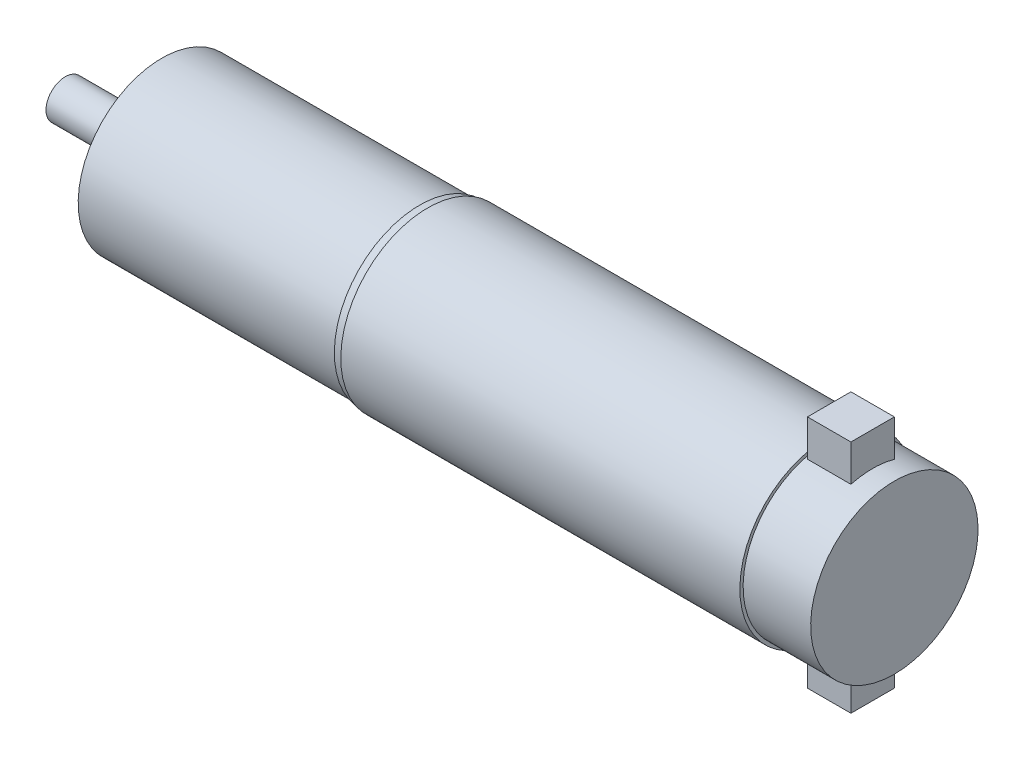
ISO-10303-21;
HEADER;
FILE_DESCRIPTION(('STEP AP214'),'2;1');
FILE_NAME('part.step','',(''),(''),'','','');
FILE_SCHEMA(('AUTOMOTIVE_DESIGN { 1 0 10303 214 1 1 1 1 }'));
ENDSEC;
DATA;
#1=APPLICATION_CONTEXT('core data for automotive mechanical design processes');
#2=APPLICATION_PROTOCOL_DEFINITION('international standard','automotive_design',2000,#1);
#3=PRODUCT_CONTEXT('',#1,'mechanical');
#4=PRODUCT('Part','Part','',(#3));
#5=PRODUCT_RELATED_PRODUCT_CATEGORY('part','',(#4));
#6=PRODUCT_DEFINITION_FORMATION('','',#4);
#7=PRODUCT_DEFINITION_CONTEXT('part definition',#1,'design');
#8=PRODUCT_DEFINITION('design','',#6,#7);
#9=PRODUCT_DEFINITION_SHAPE('','',#8);
#10=(LENGTH_UNIT() NAMED_UNIT(*) SI_UNIT(.MILLI.,.METRE.));
#11=(NAMED_UNIT(*) PLANE_ANGLE_UNIT() SI_UNIT($,.RADIAN.));
#12=(NAMED_UNIT(*) SI_UNIT($,.STERADIAN.) SOLID_ANGLE_UNIT());
#13=UNCERTAINTY_MEASURE_WITH_UNIT(LENGTH_MEASURE(1.E-05),#10,'distance_accuracy_value','');
#14=(GEOMETRIC_REPRESENTATION_CONTEXT(3) GLOBAL_UNCERTAINTY_ASSIGNED_CONTEXT((#13)) GLOBAL_UNIT_ASSIGNED_CONTEXT((#10,
#11,#12)) REPRESENTATION_CONTEXT('',''));
#15=CARTESIAN_POINT('',(0.,0.,0.));
#16=DIRECTION('',(0.,0.,1.));
#17=DIRECTION('',(1.,0.,0.));
#18=AXIS2_PLACEMENT_3D('',#15,#16,#17);
#19=CARTESIAN_POINT('',(-30.,26.,0.));
#20=DIRECTION('',(-1.,0.,0.));
#21=DIRECTION('',(0.,-1.,0.));
#22=AXIS2_PLACEMENT_3D('',#19,#20,#21);
#23=CYLINDRICAL_SURFACE('',#22,26.);
#24=CARTESIAN_POINT('',(227.6,26.,0.));
#25=DIRECTION('',(-1.,0.,0.));
#26=DIRECTION('',(0.,-1.,0.));
#27=AXIS2_PLACEMENT_3D('',#24,#25,#26);
#28=CIRCLE('',#27,26.);
#29=CARTESIAN_POINT('',(227.6,0.,0.));
#30=VERTEX_POINT('',#29);
#31=EDGE_CURVE('E127',#30,#30,#28,.T.);
#32=ORIENTED_EDGE('',*,*,#31,.T.);
#33=EDGE_LOOP('',(#32));
#34=FACE_BOUND('',#33,.T.);
#35=CARTESIAN_POINT('',(206.6,26.,0.));
#36=DIRECTION('',(-1.,0.,0.));
#37=DIRECTION('',(0.,-1.,0.));
#38=AXIS2_PLACEMENT_3D('',#35,#36,#37);
#39=CIRCLE('',#38,26.);
#40=CARTESIAN_POINT('',(206.6,0.,0.));
#41=VERTEX_POINT('',#40);
#42=EDGE_CURVE('E165',#41,#41,#39,.T.);
#43=ORIENTED_EDGE('',*,*,#42,.F.);
#44=EDGE_LOOP('',(#43));
#45=FACE_BOUND('',#44,.T.);
#46=DIRECTION('',(-1.,0.,0.));
#47=VECTOR('',#46,1.);
#48=CARTESIAN_POINT('',(-30.,0.891485507899921,-6.75));
#49=LINE('',#48,#47);
#50=CARTESIAN_POINT('',(220.85,0.891485507899928,-6.75));
#51=VERTEX_POINT('',#50);
#52=CARTESIAN_POINT('',(207.35,0.891485507899927,-6.75));
#53=VERTEX_POINT('',#52);
#54=EDGE_CURVE('E168',#51,#53,#49,.T.);
#55=ORIENTED_EDGE('',*,*,#54,.T.);
#56=CARTESIAN_POINT('',(207.35,26.,0.));
#57=DIRECTION('',(1.,0.,0.));
#58=DIRECTION('',(0.,0.,-1.));
#59=AXIS2_PLACEMENT_3D('',#56,#57,#58);
#60=CIRCLE('',#59,26.);
#61=CARTESIAN_POINT('',(207.35,0.891485507899928,6.75));
#62=VERTEX_POINT('',#61);
#63=EDGE_CURVE('E47',#53,#62,#60,.F.);
#64=ORIENTED_EDGE('',*,*,#63,.T.);
#65=DIRECTION('',(-1.,0.,0.));
#66=VECTOR('',#65,1.);
#67=CARTESIAN_POINT('',(-30.,0.891485507899921,6.75));
#68=LINE('',#67,#66);
#69=CARTESIAN_POINT('',(220.85,0.891485507899928,6.75));
#70=VERTEX_POINT('',#69);
#71=EDGE_CURVE('E174',#62,#70,#68,.F.);
#72=ORIENTED_EDGE('',*,*,#71,.T.);
#73=CARTESIAN_POINT('',(220.85,26.,0.));
#74=DIRECTION('',(-1.,0.,0.));
#75=DIRECTION('',(0.,0.,1.));
#76=AXIS2_PLACEMENT_3D('',#73,#74,#75);
#77=CIRCLE('',#76,26.);
#78=EDGE_CURVE('E171',#70,#51,#77,.F.);
#79=ORIENTED_EDGE('',*,*,#78,.T.);
#80=EDGE_LOOP('',(#55,#64,#72,#79));
#81=FACE_BOUND('',#80,.T.);
#82=DIRECTION('',(-1.,0.,0.));
#83=VECTOR('',#82,1.);
#84=CARTESIAN_POINT('',(-30.,51.1085144921001,6.75));
#85=LINE('',#84,#83);
#86=CARTESIAN_POINT('',(220.85,51.1085144921001,6.75));
#87=VERTEX_POINT('',#86);
#88=CARTESIAN_POINT('',(207.35,51.1085144921001,6.75));
#89=VERTEX_POINT('',#88);
#90=EDGE_CURVE('E41',#87,#89,#85,.T.);
#91=ORIENTED_EDGE('',*,*,#90,.T.);
#92=CARTESIAN_POINT('',(207.35,51.1085144921001,-6.75));
#93=VERTEX_POINT('',#92);
#94=EDGE_CURVE('E11',#89,#93,#60,.F.);
#95=ORIENTED_EDGE('',*,*,#94,.T.);
#96=DIRECTION('',(-1.,0.,0.));
#97=VECTOR('',#96,1.);
#98=CARTESIAN_POINT('',(-30.,51.1085144921001,-6.75));
#99=LINE('',#98,#97);
#100=CARTESIAN_POINT('',(220.85,51.1085144921001,-6.75));
#101=VERTEX_POINT('',#100);
#102=EDGE_CURVE('E178',#93,#101,#99,.F.);
#103=ORIENTED_EDGE('',*,*,#102,.T.);
#104=EDGE_CURVE('E175',#101,#87,#77,.F.);
#105=ORIENTED_EDGE('',*,*,#104,.T.);
#106=EDGE_LOOP('',(#91,#95,#103,#105));
#107=FACE_BOUND('',#106,.T.);
#108=ADVANCED_FACE('F38',(#34,#45,#81,#107),#23,.T.);
#109=CARTESIAN_POINT('',(206.6,0.,0.));
#110=DIRECTION('',(-1.,0.,0.));
#111=DIRECTION('',(0.,-1.,0.));
#112=AXIS2_PLACEMENT_3D('',#109,#110,#111);
#113=PLANE('',#112);
#114=CARTESIAN_POINT('',(206.6,26.,0.));
#115=DIRECTION('',(-1.,0.,0.));
#116=DIRECTION('',(0.,-1.,0.));
#117=AXIS2_PLACEMENT_3D('',#114,#115,#116);
#118=CIRCLE('',#117,27.);
#119=CARTESIAN_POINT('',(206.6,-0.999999999999994,0.));
#120=VERTEX_POINT('',#119);
#121=EDGE_CURVE('E162',#120,#120,#118,.T.);
#122=ORIENTED_EDGE('',*,*,#121,.F.);
#123=EDGE_LOOP('',(#122));
#124=FACE_BOUND('',#123,.T.);
#125=ORIENTED_EDGE('',*,*,#42,.T.);
#126=EDGE_LOOP('',(#125));
#127=FACE_BOUND('',#126,.T.);
#128=ADVANCED_FACE('F220',(#124,#127),#113,.F.);
#129=CARTESIAN_POINT('',(-30.,26.,0.));
#130=DIRECTION('',(-1.,0.,0.));
#131=DIRECTION('',(0.,-1.,0.));
#132=AXIS2_PLACEMENT_3D('',#129,#130,#131);
#133=CYLINDRICAL_SURFACE('',#132,27.);
#134=ORIENTED_EDGE('',*,*,#121,.T.);
#135=EDGE_LOOP('',(#134));
#136=FACE_BOUND('',#135,.T.);
#137=CARTESIAN_POINT('',(82.6,26.,0.));
#138=DIRECTION('',(-1.,0.,0.));
#139=DIRECTION('',(0.,-1.,0.));
#140=AXIS2_PLACEMENT_3D('',#137,#138,#139);
#141=CIRCLE('',#140,27.);
#142=CARTESIAN_POINT('',(82.6,-0.999999999999994,0.));
#143=VERTEX_POINT('',#142);
#144=EDGE_CURVE('E159',#143,#143,#141,.T.);
#145=ORIENTED_EDGE('',*,*,#144,.F.);
#146=EDGE_LOOP('',(#145));
#147=FACE_BOUND('',#146,.T.);
#148=ADVANCED_FACE('F225',(#136,#147),#133,.T.);
#149=CARTESIAN_POINT('',(82.6,0.,0.));
#150=DIRECTION('',(-1.,0.,0.));
#151=DIRECTION('',(0.,-1.,0.));
#152=AXIS2_PLACEMENT_3D('',#149,#150,#151);
#153=PLANE('',#152);
#154=ORIENTED_EDGE('',*,*,#144,.T.);
#155=EDGE_LOOP('',(#154));
#156=FACE_BOUND('',#155,.T.);
#157=CARTESIAN_POINT('',(82.6,26.,0.));
#158=DIRECTION('',(-1.,0.,0.));
#159=DIRECTION('',(0.,-1.,0.));
#160=AXIS2_PLACEMENT_3D('',#157,#158,#159);
#161=CIRCLE('',#160,26.5);
#162=CARTESIAN_POINT('',(82.6,-0.499999999999994,0.));
#163=VERTEX_POINT('',#162);
#164=EDGE_CURVE('E156',#163,#163,#161,.T.);
#165=ORIENTED_EDGE('',*,*,#164,.F.);
#166=EDGE_LOOP('',(#165));
#167=FACE_BOUND('',#166,.T.);
#168=ADVANCED_FACE('F295',(#156,#167),#153,.T.);
#169=CARTESIAN_POINT('',(-30.,26.,0.));
#170=DIRECTION('',(-1.,0.,0.));
#171=DIRECTION('',(0.,-1.,0.));
#172=AXIS2_PLACEMENT_3D('',#169,#170,#171);
#173=CYLINDRICAL_SURFACE('',#172,26.5);
#174=ORIENTED_EDGE('',*,*,#164,.T.);
#175=EDGE_LOOP('',(#174));
#176=FACE_BOUND('',#175,.T.);
#177=CARTESIAN_POINT('',(80.1,26.,0.));
#178=DIRECTION('',(-1.,0.,0.));
#179=DIRECTION('',(0.,-1.,0.));
#180=AXIS2_PLACEMENT_3D('',#177,#178,#179);
#181=CIRCLE('',#180,26.5);
#182=CARTESIAN_POINT('',(80.1,-0.499999999999994,0.));
#183=VERTEX_POINT('',#182);
#184=EDGE_CURVE('E153',#183,#183,#181,.T.);
#185=ORIENTED_EDGE('',*,*,#184,.F.);
#186=EDGE_LOOP('',(#185));
#187=FACE_BOUND('',#186,.T.);
#188=ADVANCED_FACE('F291',(#176,#187),#173,.T.);
#189=CARTESIAN_POINT('',(80.1,0.,0.));
#190=DIRECTION('',(-1.,0.,0.));
#191=DIRECTION('',(0.,-1.,0.));
#192=AXIS2_PLACEMENT_3D('',#189,#190,#191);
#193=PLANE('',#192);
#194=ORIENTED_EDGE('',*,*,#184,.T.);
#195=EDGE_LOOP('',(#194));
#196=FACE_BOUND('',#195,.T.);
#197=CARTESIAN_POINT('',(80.1,26.,0.));
#198=DIRECTION('',(-1.,0.,0.));
#199=DIRECTION('',(0.,-1.,0.));
#200=AXIS2_PLACEMENT_3D('',#197,#198,#199);
#201=CIRCLE('',#200,26.);
#202=CARTESIAN_POINT('',(80.1,0.,0.));
#203=VERTEX_POINT('',#202);
#204=EDGE_CURVE('E150',#203,#203,#201,.T.);
#205=ORIENTED_EDGE('',*,*,#204,.F.);
#206=EDGE_LOOP('',(#205));
#207=FACE_BOUND('',#206,.T.);
#208=ADVANCED_FACE('F287',(#196,#207),#193,.T.);
#209=CARTESIAN_POINT('',(-30.,26.,0.));
#210=DIRECTION('',(-1.,0.,0.));
#211=DIRECTION('',(0.,-1.,0.));
#212=AXIS2_PLACEMENT_3D('',#209,#210,#211);
#213=CYLINDRICAL_SURFACE('',#212,26.);
#214=ORIENTED_EDGE('',*,*,#204,.T.);
#215=EDGE_LOOP('',(#214));
#216=FACE_BOUND('',#215,.T.);
#217=CARTESIAN_POINT('',(0.,26.,0.));
#218=DIRECTION('',(-1.,0.,0.));
#219=DIRECTION('',(0.,-1.,0.));
#220=AXIS2_PLACEMENT_3D('',#217,#218,#219);
#221=CIRCLE('',#220,26.);
#222=CARTESIAN_POINT('',(0.,0.,0.));
#223=VERTEX_POINT('',#222);
#224=EDGE_CURVE('E147',#223,#223,#221,.T.);
#225=ORIENTED_EDGE('',*,*,#224,.F.);
#226=EDGE_LOOP('',(#225));
#227=FACE_BOUND('',#226,.T.);
#228=ADVANCED_FACE('F283',(#216,#227),#213,.T.);
#229=CARTESIAN_POINT('',(0.,0.,0.));
#230=DIRECTION('',(-1.,0.,0.));
#231=DIRECTION('',(0.,-1.,0.));
#232=AXIS2_PLACEMENT_3D('',#229,#230,#231);
#233=PLANE('',#232);
#234=ORIENTED_EDGE('',*,*,#224,.T.);
#235=EDGE_LOOP('',(#234));
#236=FACE_BOUND('',#235,.T.);
#237=CARTESIAN_POINT('',(0.,26.,0.));
#238=DIRECTION('',(-1.,0.,0.));
#239=DIRECTION('',(0.,-1.,0.));
#240=AXIS2_PLACEMENT_3D('',#237,#238,#239);
#241=CIRCLE('',#240,16.);
#242=CARTESIAN_POINT('',(0.,10.,0.));
#243=VERTEX_POINT('',#242);
#244=EDGE_CURVE('E144',#243,#243,#241,.T.);
#245=ORIENTED_EDGE('',*,*,#244,.F.);
#246=EDGE_LOOP('',(#245));
#247=FACE_BOUND('',#246,.T.);
#248=ADVANCED_FACE('F279',(#236,#247),#233,.T.);
#249=CARTESIAN_POINT('',(-30.,26.,0.));
#250=DIRECTION('',(-1.,0.,0.));
#251=DIRECTION('',(0.,-1.,0.));
#252=AXIS2_PLACEMENT_3D('',#249,#250,#251);
#253=CYLINDRICAL_SURFACE('',#252,16.);
#254=CARTESIAN_POINT('',(-2.,26.,0.));
#255=DIRECTION('',(-1.,0.,0.));
#256=DIRECTION('',(0.,-1.,0.));
#257=AXIS2_PLACEMENT_3D('',#254,#255,#256);
#258=CIRCLE('',#257,16.);
#259=CARTESIAN_POINT('',(-2.,10.,0.));
#260=VERTEX_POINT('',#259);
#261=EDGE_CURVE('E141',#260,#260,#258,.T.);
#262=ORIENTED_EDGE('',*,*,#261,.F.);
#263=EDGE_LOOP('',(#262));
#264=FACE_BOUND('',#263,.T.);
#265=ORIENTED_EDGE('',*,*,#244,.T.);
#266=EDGE_LOOP('',(#265));
#267=FACE_BOUND('',#266,.T.);
#268=ADVANCED_FACE('F275',(#264,#267),#253,.T.);
#269=CARTESIAN_POINT('',(-2.,0.,0.));
#270=DIRECTION('',(1.,0.,0.));
#271=DIRECTION('',(0.,1.,0.));
#272=AXIS2_PLACEMENT_3D('',#269,#270,#271);
#273=PLANE('',#272);
#274=CARTESIAN_POINT('',(-2.,26.,0.));
#275=DIRECTION('',(-1.,0.,0.));
#276=DIRECTION('',(0.,-1.,0.));
#277=AXIS2_PLACEMENT_3D('',#274,#275,#276);
#278=CIRCLE('',#277,6.);
#279=CARTESIAN_POINT('',(-2.,20.,0.));
#280=VERTEX_POINT('',#279);
#281=EDGE_CURVE('E138',#280,#280,#278,.T.);
#282=ORIENTED_EDGE('',*,*,#281,.F.);
#283=EDGE_LOOP('',(#282));
#284=FACE_BOUND('',#283,.T.);
#285=ORIENTED_EDGE('',*,*,#261,.T.);
#286=EDGE_LOOP('',(#285));
#287=FACE_BOUND('',#286,.T.);
#288=ADVANCED_FACE('F271',(#284,#287),#273,.F.);
#289=CARTESIAN_POINT('',(-30.,26.,0.));
#290=DIRECTION('',(-1.,0.,0.));
#291=DIRECTION('',(0.,-1.,0.));
#292=AXIS2_PLACEMENT_3D('',#289,#290,#291);
#293=CYLINDRICAL_SURFACE('',#292,6.);
#294=CARTESIAN_POINT('',(-30.,26.,0.));
#295=DIRECTION('',(-1.,0.,0.));
#296=DIRECTION('',(0.,-1.,0.));
#297=AXIS2_PLACEMENT_3D('',#294,#295,#296);
#298=CIRCLE('',#297,6.);
#299=CARTESIAN_POINT('',(-30.,20.,0.));
#300=VERTEX_POINT('',#299);
#301=EDGE_CURVE('E131',#300,#300,#298,.T.);
#302=ORIENTED_EDGE('',*,*,#301,.F.);
#303=EDGE_LOOP('',(#302));
#304=FACE_BOUND('',#303,.T.);
#305=ORIENTED_EDGE('',*,*,#281,.T.);
#306=EDGE_LOOP('',(#305));
#307=FACE_BOUND('',#306,.T.);
#308=ADVANCED_FACE('F265',(#304,#307),#293,.T.);
#309=CARTESIAN_POINT('',(-30.,0.,0.));
#310=DIRECTION('',(1.,0.,0.));
#311=DIRECTION('',(0.,1.,0.));
#312=AXIS2_PLACEMENT_3D('',#309,#310,#311);
#313=PLANE('',#312);
#314=ORIENTED_EDGE('',*,*,#301,.T.);
#315=EDGE_LOOP('',(#314));
#316=FACE_BOUND('',#315,.T.);
#317=ADVANCED_FACE('F259',(#316),#313,.F.);
#318=CARTESIAN_POINT('',(227.6,0.,0.));
#319=DIRECTION('',(1.,0.,0.));
#320=DIRECTION('',(0.,1.,0.));
#321=AXIS2_PLACEMENT_3D('',#318,#319,#320);
#322=PLANE('',#321);
#323=ORIENTED_EDGE('',*,*,#31,.F.);
#324=EDGE_LOOP('',(#323));
#325=FACE_BOUND('',#324,.T.);
#326=ADVANCED_FACE('F255',(#325),#322,.T.);
#327=CARTESIAN_POINT('',(0.,-10.5,0.));
#328=DIRECTION('',(0.,1.,0.));
#329=DIRECTION('',(0.,0.,1.));
#330=AXIS2_PLACEMENT_3D('',#327,#328,#329);
#331=PLANE('',#330);
#332=DIRECTION('',(0.,0.,1.));
#333=VECTOR('',#332,1.);
#334=CARTESIAN_POINT('',(207.35,-10.5,-6.75));
#335=LINE('',#334,#333);
#336=CARTESIAN_POINT('',(207.35,-10.5,-6.75));
#337=VERTEX_POINT('',#336);
#338=CARTESIAN_POINT('',(207.35,-10.5,6.75));
#339=VERTEX_POINT('',#338);
#340=EDGE_CURVE('E198',#337,#339,#335,.T.);
#341=ORIENTED_EDGE('',*,*,#340,.F.);
#342=DIRECTION('',(-1.,0.,0.));
#343=VECTOR('',#342,1.);
#344=CARTESIAN_POINT('',(207.35,-10.5,-6.75));
#345=LINE('',#344,#343);
#346=CARTESIAN_POINT('',(220.85,-10.5,-6.75));
#347=VERTEX_POINT('',#346);
#348=EDGE_CURVE('E124',#347,#337,#345,.T.);
#349=ORIENTED_EDGE('',*,*,#348,.F.);
#350=DIRECTION('',(0.,0.,-1.));
#351=VECTOR('',#350,1.);
#352=CARTESIAN_POINT('',(220.85,-10.5,-6.75));
#353=LINE('',#352,#351);
#354=CARTESIAN_POINT('',(220.85,-10.5,6.75));
#355=VERTEX_POINT('',#354);
#356=EDGE_CURVE('E194',#355,#347,#353,.T.);
#357=ORIENTED_EDGE('',*,*,#356,.F.);
#358=DIRECTION('',(1.,0.,0.));
#359=VECTOR('',#358,1.);
#360=CARTESIAN_POINT('',(207.35,-10.5,6.75));
#361=LINE('',#360,#359);
#362=EDGE_CURVE('E196',#339,#355,#361,.T.);
#363=ORIENTED_EDGE('',*,*,#362,.F.);
#364=EDGE_LOOP('',(#341,#349,#357,#363));
#365=FACE_BOUND('',#364,.T.);
#366=ADVANCED_FACE('F218',(#365),#331,.F.);
#367=CARTESIAN_POINT('',(207.35,62.5,-6.75));
#368=DIRECTION('',(0.,0.,1.));
#369=DIRECTION('',(1.,0.,0.));
#370=AXIS2_PLACEMENT_3D('',#367,#368,#369);
#371=PLANE('',#370);
#372=ORIENTED_EDGE('',*,*,#54,.F.);
#373=DIRECTION('',(0.,-1.,0.));
#374=VECTOR('',#373,1.);
#375=CARTESIAN_POINT('',(220.85,62.5,-6.75));
#376=LINE('',#375,#374);
#377=EDGE_CURVE('E189',#51,#347,#376,.T.);
#378=ORIENTED_EDGE('',*,*,#377,.T.);
#379=ORIENTED_EDGE('',*,*,#348,.T.);
#380=DIRECTION('',(0.,-1.,0.));
#381=VECTOR('',#380,1.);
#382=CARTESIAN_POINT('',(207.35,62.5,-6.75));
#383=LINE('',#382,#381);
#384=EDGE_CURVE('E62',#53,#337,#383,.T.);
#385=ORIENTED_EDGE('',*,*,#384,.F.);
#386=EDGE_LOOP('',(#372,#378,#379,#385));
#387=FACE_BOUND('',#386,.T.);
#388=ADVANCED_FACE('F206',(#387),#371,.F.);
#389=CARTESIAN_POINT('',(220.85,62.5,-6.75));
#390=DIRECTION('',(-1.,0.,0.));
#391=DIRECTION('',(0.,0.,1.));
#392=AXIS2_PLACEMENT_3D('',#389,#390,#391);
#393=PLANE('',#392);
#394=ORIENTED_EDGE('',*,*,#78,.F.);
#395=DIRECTION('',(0.,-1.,0.));
#396=VECTOR('',#395,1.);
#397=CARTESIAN_POINT('',(220.85,62.5,6.75));
#398=LINE('',#397,#396);
#399=EDGE_CURVE('E184',#70,#355,#398,.T.);
#400=ORIENTED_EDGE('',*,*,#399,.T.);
#401=ORIENTED_EDGE('',*,*,#356,.T.);
#402=ORIENTED_EDGE('',*,*,#377,.F.);
#403=EDGE_LOOP('',(#394,#400,#401,#402));
#404=FACE_BOUND('',#403,.T.);
#405=ADVANCED_FACE('F217',(#404),#393,.F.);
#406=CARTESIAN_POINT('',(207.35,62.5,6.75));
#407=DIRECTION('',(0.,0.,-1.));
#408=DIRECTION('',(-1.,0.,0.));
#409=AXIS2_PLACEMENT_3D('',#406,#407,#408);
#410=PLANE('',#409);
#411=ORIENTED_EDGE('',*,*,#71,.F.);
#412=DIRECTION('',(0.,-1.,0.));
#413=VECTOR('',#412,1.);
#414=CARTESIAN_POINT('',(207.35,62.5,6.75));
#415=LINE('',#414,#413);
#416=EDGE_CURVE('E128',#62,#339,#415,.T.);
#417=ORIENTED_EDGE('',*,*,#416,.T.);
#418=ORIENTED_EDGE('',*,*,#362,.T.);
#419=ORIENTED_EDGE('',*,*,#399,.F.);
#420=EDGE_LOOP('',(#411,#417,#418,#419));
#421=FACE_BOUND('',#420,.T.);
#422=ADVANCED_FACE('F212',(#421),#410,.F.);
#423=CARTESIAN_POINT('',(207.35,62.5,-6.75));
#424=DIRECTION('',(1.,0.,0.));
#425=DIRECTION('',(0.,0.,-1.));
#426=AXIS2_PLACEMENT_3D('',#423,#424,#425);
#427=PLANE('',#426);
#428=ORIENTED_EDGE('',*,*,#63,.F.);
#429=ORIENTED_EDGE('',*,*,#384,.T.);
#430=ORIENTED_EDGE('',*,*,#340,.T.);
#431=ORIENTED_EDGE('',*,*,#416,.F.);
#432=EDGE_LOOP('',(#428,#429,#430,#431));
#433=FACE_BOUND('',#432,.T.);
#434=ADVANCED_FACE('F204',(#433),#427,.F.);
#435=ORIENTED_EDGE('',*,*,#102,.F.);
#436=CARTESIAN_POINT('',(207.35,62.5,-6.75));
#437=VERTEX_POINT('',#436);
#438=EDGE_CURVE('E190',#437,#93,#383,.T.);
#439=ORIENTED_EDGE('',*,*,#438,.F.);
#440=DIRECTION('',(-1.,0.,0.));
#441=VECTOR('',#440,1.);
#442=CARTESIAN_POINT('',(207.35,62.5,-6.75));
#443=LINE('',#442,#441);
#444=CARTESIAN_POINT('',(220.85,62.5,-6.75));
#445=VERTEX_POINT('',#444);
#446=EDGE_CURVE('E120',#445,#437,#443,.T.);
#447=ORIENTED_EDGE('',*,*,#446,.F.);
#448=EDGE_CURVE('E54',#445,#101,#376,.T.);
#449=ORIENTED_EDGE('',*,*,#448,.T.);
#450=EDGE_LOOP('',(#435,#439,#447,#449));
#451=FACE_BOUND('',#450,.T.);
#452=ADVANCED_FACE('F202',(#451),#371,.F.);
#453=ORIENTED_EDGE('',*,*,#94,.F.);
#454=CARTESIAN_POINT('',(207.35,62.5,6.75));
#455=VERTEX_POINT('',#454);
#456=EDGE_CURVE('E109',#455,#89,#415,.T.);
#457=ORIENTED_EDGE('',*,*,#456,.F.);
#458=DIRECTION('',(0.,0.,1.));
#459=VECTOR('',#458,1.);
#460=CARTESIAN_POINT('',(207.35,62.5,-6.75));
#461=LINE('',#460,#459);
#462=EDGE_CURVE('E116',#437,#455,#461,.T.);
#463=ORIENTED_EDGE('',*,*,#462,.F.);
#464=ORIENTED_EDGE('',*,*,#438,.T.);
#465=EDGE_LOOP('',(#453,#457,#463,#464));
#466=FACE_BOUND('',#465,.T.);
#467=ADVANCED_FACE('F126',(#466),#427,.F.);
#468=ORIENTED_EDGE('',*,*,#90,.F.);
#469=CARTESIAN_POINT('',(220.85,62.5,6.75));
#470=VERTEX_POINT('',#469);
#471=EDGE_CURVE('E112',#470,#87,#398,.T.);
#472=ORIENTED_EDGE('',*,*,#471,.F.);
#473=DIRECTION('',(1.,0.,0.));
#474=VECTOR('',#473,1.);
#475=CARTESIAN_POINT('',(207.35,62.5,6.75));
#476=LINE('',#475,#474);
#477=EDGE_CURVE('E105',#455,#470,#476,.T.);
#478=ORIENTED_EDGE('',*,*,#477,.F.);
#479=ORIENTED_EDGE('',*,*,#456,.T.);
#480=EDGE_LOOP('',(#468,#472,#478,#479));
#481=FACE_BOUND('',#480,.T.);
#482=ADVANCED_FACE('F107',(#481),#410,.F.);
#483=ORIENTED_EDGE('',*,*,#104,.F.);
#484=ORIENTED_EDGE('',*,*,#448,.F.);
#485=DIRECTION('',(0.,0.,-1.));
#486=VECTOR('',#485,1.);
#487=CARTESIAN_POINT('',(220.85,62.5,-6.75));
#488=LINE('',#487,#486);
#489=EDGE_CURVE('E115',#470,#445,#488,.T.);
#490=ORIENTED_EDGE('',*,*,#489,.F.);
#491=ORIENTED_EDGE('',*,*,#471,.T.);
#492=EDGE_LOOP('',(#483,#484,#490,#491));
#493=FACE_BOUND('',#492,.T.);
#494=ADVANCED_FACE('F183',(#493),#393,.F.);
#495=CARTESIAN_POINT('',(0.,62.5,0.));
#496=DIRECTION('',(0.,1.,0.));
#497=DIRECTION('',(0.,0.,1.));
#498=AXIS2_PLACEMENT_3D('',#495,#496,#497);
#499=PLANE('',#498);
#500=ORIENTED_EDGE('',*,*,#462,.T.);
#501=ORIENTED_EDGE('',*,*,#477,.T.);
#502=ORIENTED_EDGE('',*,*,#489,.T.);
#503=ORIENTED_EDGE('',*,*,#446,.T.);
#504=EDGE_LOOP('',(#500,#501,#502,#503));
#505=FACE_BOUND('',#504,.T.);
#506=ADVANCED_FACE('F119',(#505),#499,.T.);
#507=CLOSED_SHELL('',(#108,#128,#148,#168,#188,#208,#228,#248,#268,#288,#308,#317,#326,#366,
#388,#405,#422,#434,#452,#467,#482,#494,#506));
#508=MANIFOLD_SOLID_BREP('B2',#507);
#509=ADVANCED_BREP_SHAPE_REPRESENTATION('',(#18,#508),#14);
#510=SHAPE_DEFINITION_REPRESENTATION(#9,#509);
ENDSEC;
END-ISO-10303-21;
